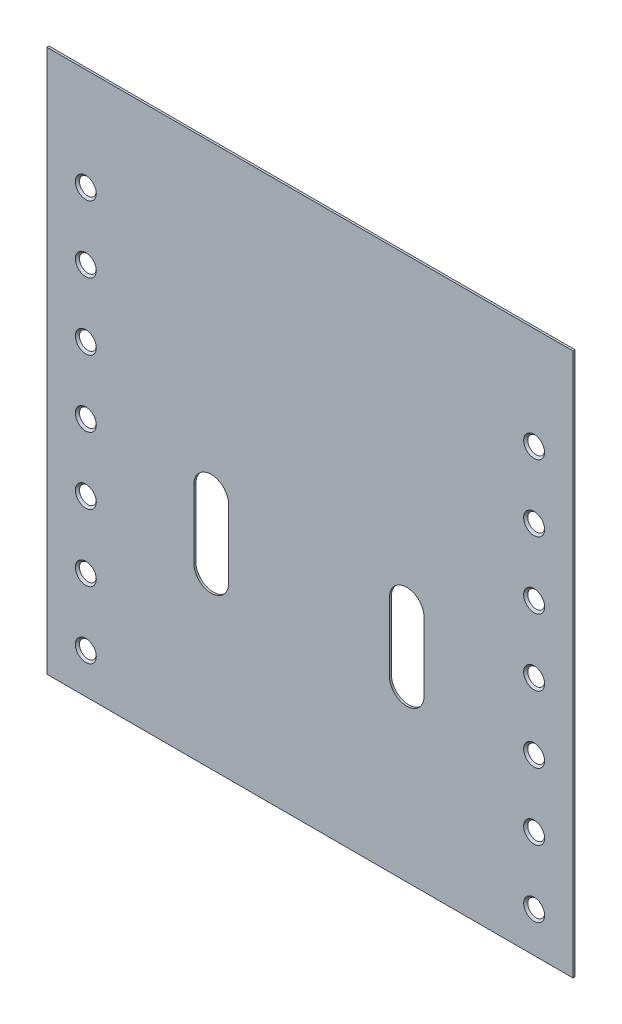
ISO-10303-21;
HEADER;
FILE_DESCRIPTION(('STEP AP214'),'2;1');
FILE_NAME('part.step','',(''),(''),'','','');
FILE_SCHEMA(('AUTOMOTIVE_DESIGN { 1 0 10303 214 1 1 1 1 }'));
ENDSEC;
DATA;
#1=APPLICATION_CONTEXT('core data for automotive mechanical design processes');
#2=APPLICATION_PROTOCOL_DEFINITION('international standard','automotive_design',2000,#1);
#3=PRODUCT_CONTEXT('',#1,'mechanical');
#4=PRODUCT('Part','Part','',(#3));
#5=PRODUCT_RELATED_PRODUCT_CATEGORY('part','',(#4));
#6=PRODUCT_DEFINITION_FORMATION('','',#4);
#7=PRODUCT_DEFINITION_CONTEXT('part definition',#1,'design');
#8=PRODUCT_DEFINITION('design','',#6,#7);
#9=PRODUCT_DEFINITION_SHAPE('','',#8);
#10=(LENGTH_UNIT() NAMED_UNIT(*) SI_UNIT(.MILLI.,.METRE.));
#11=(NAMED_UNIT(*) PLANE_ANGLE_UNIT() SI_UNIT($,.RADIAN.));
#12=(NAMED_UNIT(*) SI_UNIT($,.STERADIAN.) SOLID_ANGLE_UNIT());
#13=UNCERTAINTY_MEASURE_WITH_UNIT(LENGTH_MEASURE(1.E-05),#10,'distance_accuracy_value','');
#14=(GEOMETRIC_REPRESENTATION_CONTEXT(3) GLOBAL_UNCERTAINTY_ASSIGNED_CONTEXT((#13)) GLOBAL_UNIT_ASSIGNED_CONTEXT((#10,
#11,#12)) REPRESENTATION_CONTEXT('',''));
#15=CARTESIAN_POINT('',(0.,0.,0.));
#16=DIRECTION('',(0.,0.,1.));
#17=DIRECTION('',(1.,0.,0.));
#18=AXIS2_PLACEMENT_3D('',#15,#16,#17);
#19=CARTESIAN_POINT('',(0.,0.,-0.7747));
#20=DIRECTION('',(0.,0.,-1.));
#21=DIRECTION('',(-1.,0.,0.));
#22=AXIS2_PLACEMENT_3D('',#19,#20,#21);
#23=PLANE('',#22);
#24=CARTESIAN_POINT('',(-20.9050000000001,-222.,-0.7747));
#25=DIRECTION('',(0.,0.,-1.));
#26=DIRECTION('',(-1.,0.,0.));
#27=AXIS2_PLACEMENT_3D('',#24,#25,#26);
#28=CIRCLE('',#27,3.1373);
#29=CARTESIAN_POINT('',(-24.0423000000001,-222.,-0.7747));
#30=VERTEX_POINT('',#29);
#31=EDGE_CURVE('E36',#30,#30,#28,.T.);
#32=ORIENTED_EDGE('',*,*,#31,.F.);
#33=EDGE_LOOP('',(#32));
#34=FACE_BOUND('',#33,.T.);
#35=CARTESIAN_POINT('',(-20.9050000000003,-147.,-0.7747));
#36=DIRECTION('',(0.,0.,-1.));
#37=DIRECTION('',(-1.,0.,0.));
#38=AXIS2_PLACEMENT_3D('',#35,#36,#37);
#39=CIRCLE('',#38,3.1373);
#40=CARTESIAN_POINT('',(-24.0423000000003,-147.,-0.7747));
#41=VERTEX_POINT('',#40);
#42=EDGE_CURVE('E172',#41,#41,#39,.T.);
#43=ORIENTED_EDGE('',*,*,#42,.F.);
#44=EDGE_LOOP('',(#43));
#45=FACE_BOUND('',#44,.T.);
#46=CARTESIAN_POINT('',(-20.9050000000003,-71.9999999999999,-0.7747));
#47=DIRECTION('',(0.,0.,-1.));
#48=DIRECTION('',(-1.,0.,0.));
#49=AXIS2_PLACEMENT_3D('',#46,#47,#48);
#50=CIRCLE('',#49,3.1373);
#51=CARTESIAN_POINT('',(-24.0423000000003,-71.9999999999999,-0.7747));
#52=VERTEX_POINT('',#51);
#53=EDGE_CURVE('E197',#52,#52,#50,.T.);
#54=ORIENTED_EDGE('',*,*,#53,.F.);
#55=EDGE_LOOP('',(#54));
#56=FACE_BOUND('',#55,.T.);
#57=CARTESIAN_POINT('',(-188.645,-222.,-0.7747));
#58=DIRECTION('',(0.,0.,-1.));
#59=DIRECTION('',(-1.,0.,0.));
#60=AXIS2_PLACEMENT_3D('',#57,#58,#59);
#61=CIRCLE('',#60,3.1373);
#62=CARTESIAN_POINT('',(-191.7823,-222.,-0.7747));
#63=VERTEX_POINT('',#62);
#64=EDGE_CURVE('E203',#63,#63,#61,.T.);
#65=ORIENTED_EDGE('',*,*,#64,.F.);
#66=EDGE_LOOP('',(#65));
#67=FACE_BOUND('',#66,.T.);
#68=CARTESIAN_POINT('',(-188.645,-172.,-0.7747));
#69=DIRECTION('',(0.,0.,-1.));
#70=DIRECTION('',(-1.,0.,0.));
#71=AXIS2_PLACEMENT_3D('',#68,#69,#70);
#72=CIRCLE('',#71,3.1373);
#73=CARTESIAN_POINT('',(-191.7823,-172.,-0.7747));
#74=VERTEX_POINT('',#73);
#75=EDGE_CURVE('E215',#74,#74,#72,.T.);
#76=ORIENTED_EDGE('',*,*,#75,.F.);
#77=EDGE_LOOP('',(#76));
#78=FACE_BOUND('',#77,.T.);
#79=CARTESIAN_POINT('',(-188.645,-122.,-0.7747));
#80=DIRECTION('',(0.,0.,-1.));
#81=DIRECTION('',(-1.,0.,0.));
#82=AXIS2_PLACEMENT_3D('',#79,#80,#81);
#83=CIRCLE('',#82,3.1373);
#84=CARTESIAN_POINT('',(-191.7823,-122.,-0.7747));
#85=VERTEX_POINT('',#84);
#86=EDGE_CURVE('E227',#85,#85,#83,.T.);
#87=ORIENTED_EDGE('',*,*,#86,.F.);
#88=EDGE_LOOP('',(#87));
#89=FACE_BOUND('',#88,.T.);
#90=CARTESIAN_POINT('',(-188.645,-72.,-0.7747));
#91=DIRECTION('',(0.,0.,-1.));
#92=DIRECTION('',(-1.,0.,0.));
#93=AXIS2_PLACEMENT_3D('',#90,#91,#92);
#94=CIRCLE('',#93,3.1373);
#95=CARTESIAN_POINT('',(-191.7823,-72.,-0.7747));
#96=VERTEX_POINT('',#95);
#97=EDGE_CURVE('E141',#96,#96,#94,.T.);
#98=ORIENTED_EDGE('',*,*,#97,.F.);
#99=EDGE_LOOP('',(#98));
#100=FACE_BOUND('',#99,.T.);
#101=CARTESIAN_POINT('',(-68.5692532358968,-173.5,-0.774699999999979));
#102=DIRECTION('',(0.,0.,-1.));
#103=DIRECTION('',(0.,1.,0.));
#104=AXIS2_PLACEMENT_3D('',#101,#102,#103);
#105=CIRCLE('',#104,6.5);
#106=CARTESIAN_POINT('',(-62.0692532358968,-173.5,-0.774699999999979));
#107=VERTEX_POINT('',#106);
#108=CARTESIAN_POINT('',(-75.0692532358968,-173.5,-0.7747));
#109=VERTEX_POINT('',#108);
#110=EDGE_CURVE('E57',#107,#109,#105,.T.);
#111=ORIENTED_EDGE('',*,*,#110,.F.);
#112=DIRECTION('',(0.,-1.,0.));
#113=VECTOR('',#112,1.);
#114=CARTESIAN_POINT('',(-62.0692532358968,-173.5,-0.774699999999979));
#115=LINE('',#114,#113);
#116=CARTESIAN_POINT('',(-62.0692532358968,-148.,-0.774699999999982));
#117=VERTEX_POINT('',#116);
#118=EDGE_CURVE('E272',#117,#107,#115,.T.);
#119=ORIENTED_EDGE('',*,*,#118,.F.);
#120=CARTESIAN_POINT('',(-68.5692532358968,-148.,-0.774699999999982));
#121=DIRECTION('',(0.,0.,-1.));
#122=DIRECTION('',(0.,1.,0.));
#123=AXIS2_PLACEMENT_3D('',#120,#121,#122);
#124=CIRCLE('',#123,6.5);
#125=CARTESIAN_POINT('',(-75.0692532358968,-148.,-0.774699999999982));
#126=VERTEX_POINT('',#125);
#127=EDGE_CURVE('E286',#126,#117,#124,.T.);
#128=ORIENTED_EDGE('',*,*,#127,.F.);
#129=DIRECTION('',(0.,1.,0.));
#130=VECTOR('',#129,1.);
#131=CARTESIAN_POINT('',(-75.0692532358968,-173.5,-0.774699999999979));
#132=LINE('',#131,#130);
#133=EDGE_CURVE('E283',#109,#126,#132,.T.);
#134=ORIENTED_EDGE('',*,*,#133,.F.);
#135=EDGE_LOOP('',(#111,#119,#128,#134));
#136=FACE_BOUND('',#135,.T.);
#137=CARTESIAN_POINT('',(-141.721253235897,-173.5,-0.774699999999979));
#138=DIRECTION('',(0.,0.,-1.));
#139=DIRECTION('',(0.,1.,0.));
#140=AXIS2_PLACEMENT_3D('',#137,#138,#139);
#141=CIRCLE('',#140,6.49999999999995);
#142=CARTESIAN_POINT('',(-135.221253235897,-173.5,-0.774699999999979));
#143=VERTEX_POINT('',#142);
#144=CARTESIAN_POINT('',(-148.221253235897,-173.5,-0.7747));
#145=VERTEX_POINT('',#144);
#146=EDGE_CURVE('E49',#143,#145,#141,.T.);
#147=ORIENTED_EDGE('',*,*,#146,.F.);
#148=DIRECTION('',(0.,-1.,0.));
#149=VECTOR('',#148,1.);
#150=CARTESIAN_POINT('',(-135.221253235897,-173.5,-0.774699999999979));
#151=LINE('',#150,#149);
#152=CARTESIAN_POINT('',(-135.221253235897,-148.,-0.774699999999982));
#153=VERTEX_POINT('',#152);
#154=EDGE_CURVE('E242',#153,#143,#151,.T.);
#155=ORIENTED_EDGE('',*,*,#154,.F.);
#156=CARTESIAN_POINT('',(-141.721253235897,-148.,-0.774699999999982));
#157=DIRECTION('',(0.,0.,-1.));
#158=DIRECTION('',(0.,1.,0.));
#159=AXIS2_PLACEMENT_3D('',#156,#157,#158);
#160=CIRCLE('',#159,6.49999999999995);
#161=CARTESIAN_POINT('',(-148.221253235897,-148.,-0.774699999999982));
#162=VERTEX_POINT('',#161);
#163=EDGE_CURVE('E257',#162,#153,#160,.T.);
#164=ORIENTED_EDGE('',*,*,#163,.F.);
#165=DIRECTION('',(0.,1.,0.));
#166=VECTOR('',#165,1.);
#167=CARTESIAN_POINT('',(-148.221253235897,-173.5,-0.774699999999979));
#168=LINE('',#167,#166);
#169=EDGE_CURVE('E253',#145,#162,#168,.T.);
#170=ORIENTED_EDGE('',*,*,#169,.F.);
#171=EDGE_LOOP('',(#147,#155,#164,#170));
#172=FACE_BOUND('',#171,.T.);
#173=DIRECTION('',(0.,1.,0.));
#174=VECTOR('',#173,1.);
#175=CARTESIAN_POINT('',(-203.2,-237.,-0.7747));
#176=LINE('',#175,#174);
#177=CARTESIAN_POINT('',(-203.2,-237.,-0.7747));
#178=VERTEX_POINT('',#177);
#179=CARTESIAN_POINT('',(-203.2,-33.7999999999999,-0.7747));
#180=VERTEX_POINT('',#179);
#181=EDGE_CURVE('E149',#178,#180,#176,.T.);
#182=ORIENTED_EDGE('',*,*,#181,.T.);
#183=DIRECTION('',(1.,0.,0.));
#184=VECTOR('',#183,1.);
#185=CARTESIAN_POINT('',(-203.2,-33.7999999999999,-0.7747));
#186=LINE('',#185,#184);
#187=CARTESIAN_POINT('',(-6.35000000000006,-33.8,-0.7747));
#188=VERTEX_POINT('',#187);
#189=EDGE_CURVE('E145',#180,#188,#186,.T.);
#190=ORIENTED_EDGE('',*,*,#189,.T.);
#191=DIRECTION('',(0.,-1.,0.));
#192=VECTOR('',#191,1.);
#193=CARTESIAN_POINT('',(-6.35000000000001,-237.,-0.7747));
#194=LINE('',#193,#192);
#195=CARTESIAN_POINT('',(-6.35000000000001,-237.,-0.7747));
#196=VERTEX_POINT('',#195);
#197=EDGE_CURVE('E148',#188,#196,#194,.T.);
#198=ORIENTED_EDGE('',*,*,#197,.T.);
#199=DIRECTION('',(-1.,0.,0.));
#200=VECTOR('',#199,1.);
#201=CARTESIAN_POINT('',(-203.2,-237.,-0.7747));
#202=LINE('',#201,#200);
#203=EDGE_CURVE('E151',#196,#178,#202,.T.);
#204=ORIENTED_EDGE('',*,*,#203,.T.);
#205=EDGE_LOOP('',(#182,#190,#198,#204));
#206=FACE_BOUND('',#205,.T.);
#207=CARTESIAN_POINT('',(-188.645,-96.9999999999999,-0.7747));
#208=DIRECTION('',(0.,0.,-1.));
#209=DIRECTION('',(-1.,0.,0.));
#210=AXIS2_PLACEMENT_3D('',#207,#208,#209);
#211=CIRCLE('',#210,3.1373);
#212=CARTESIAN_POINT('',(-191.7823,-96.9999999999999,-0.7747));
#213=VERTEX_POINT('',#212);
#214=EDGE_CURVE('E233',#213,#213,#211,.T.);
#215=ORIENTED_EDGE('',*,*,#214,.F.);
#216=EDGE_LOOP('',(#215));
#217=FACE_BOUND('',#216,.T.);
#218=CARTESIAN_POINT('',(-188.645,-147.,-0.7747));
#219=DIRECTION('',(0.,0.,-1.));
#220=DIRECTION('',(-1.,0.,0.));
#221=AXIS2_PLACEMENT_3D('',#218,#219,#220);
#222=CIRCLE('',#221,3.1373);
#223=CARTESIAN_POINT('',(-191.7823,-147.,-0.7747));
#224=VERTEX_POINT('',#223);
#225=EDGE_CURVE('E221',#224,#224,#222,.T.);
#226=ORIENTED_EDGE('',*,*,#225,.F.);
#227=EDGE_LOOP('',(#226));
#228=FACE_BOUND('',#227,.T.);
#229=CARTESIAN_POINT('',(-188.645,-197.,-0.7747));
#230=DIRECTION('',(0.,0.,-1.));
#231=DIRECTION('',(-1.,0.,0.));
#232=AXIS2_PLACEMENT_3D('',#229,#230,#231);
#233=CIRCLE('',#232,3.1373);
#234=CARTESIAN_POINT('',(-191.7823,-197.,-0.7747));
#235=VERTEX_POINT('',#234);
#236=EDGE_CURVE('E209',#235,#235,#233,.T.);
#237=ORIENTED_EDGE('',*,*,#236,.F.);
#238=EDGE_LOOP('',(#237));
#239=FACE_BOUND('',#238,.T.);
#240=CARTESIAN_POINT('',(-20.9050000000003,-96.9999999999999,-0.7747));
#241=DIRECTION('',(0.,0.,-1.));
#242=DIRECTION('',(-1.,0.,0.));
#243=AXIS2_PLACEMENT_3D('',#240,#241,#242);
#244=CIRCLE('',#243,3.1373);
#245=CARTESIAN_POINT('',(-24.0423000000003,-96.9999999999999,-0.7747));
#246=VERTEX_POINT('',#245);
#247=EDGE_CURVE('E168',#246,#246,#244,.T.);
#248=ORIENTED_EDGE('',*,*,#247,.F.);
#249=EDGE_LOOP('',(#248));
#250=FACE_BOUND('',#249,.T.);
#251=CARTESIAN_POINT('',(-20.9050000000003,-122.,-0.7747));
#252=DIRECTION('',(0.,0.,-1.));
#253=DIRECTION('',(-1.,0.,0.));
#254=AXIS2_PLACEMENT_3D('',#251,#252,#253);
#255=CIRCLE('',#254,3.1373);
#256=CARTESIAN_POINT('',(-24.0423000000003,-122.,-0.7747));
#257=VERTEX_POINT('',#256);
#258=EDGE_CURVE('E179',#257,#257,#255,.T.);
#259=ORIENTED_EDGE('',*,*,#258,.F.);
#260=EDGE_LOOP('',(#259));
#261=FACE_BOUND('',#260,.T.);
#262=CARTESIAN_POINT('',(-20.9050000000003,-172.,-0.7747));
#263=DIRECTION('',(0.,0.,-1.));
#264=DIRECTION('',(-1.,0.,0.));
#265=AXIS2_PLACEMENT_3D('',#262,#263,#264);
#266=CIRCLE('',#265,3.1373);
#267=CARTESIAN_POINT('',(-24.0423000000003,-172.,-0.7747));
#268=VERTEX_POINT('',#267);
#269=EDGE_CURVE('E182',#268,#268,#266,.T.);
#270=ORIENTED_EDGE('',*,*,#269,.F.);
#271=EDGE_LOOP('',(#270));
#272=FACE_BOUND('',#271,.T.);
#273=CARTESIAN_POINT('',(-20.9050000000003,-197.,-0.7747));
#274=DIRECTION('',(0.,0.,-1.));
#275=DIRECTION('',(-1.,0.,0.));
#276=AXIS2_PLACEMENT_3D('',#273,#274,#275);
#277=CIRCLE('',#276,3.1373);
#278=CARTESIAN_POINT('',(-24.0423000000003,-197.,-0.7747));
#279=VERTEX_POINT('',#278);
#280=EDGE_CURVE('E611',#279,#279,#277,.T.);
#281=ORIENTED_EDGE('',*,*,#280,.F.);
#282=EDGE_LOOP('',(#281));
#283=FACE_BOUND('',#282,.T.);
#284=ADVANCED_FACE('F32',(#34,#45,#56,#67,#78,#89,#100,#136,#172,#206,#217,#228,#239,#250,#261,
#272,#283),#23,.T.);
#285=CARTESIAN_POINT('',(0.,0.,0.));
#286=DIRECTION('',(0.,0.,-1.));
#287=DIRECTION('',(-1.,0.,0.));
#288=AXIS2_PLACEMENT_3D('',#285,#286,#287);
#289=PLANE('',#288);
#290=CARTESIAN_POINT('',(-20.9050000000001,-222.,0.));
#291=DIRECTION('',(0.,0.,1.));
#292=DIRECTION('',(1.,0.,0.));
#293=AXIS2_PLACEMENT_3D('',#290,#291,#292);
#294=CIRCLE('',#293,3.912);
#295=CARTESIAN_POINT('',(-16.9930000000001,-222.,0.));
#296=VERTEX_POINT('',#295);
#297=EDGE_CURVE('E618',#296,#296,#294,.T.);
#298=ORIENTED_EDGE('',*,*,#297,.F.);
#299=EDGE_LOOP('',(#298));
#300=FACE_BOUND('',#299,.T.);
#301=CARTESIAN_POINT('',(-20.9050000000003,-147.,0.));
#302=DIRECTION('',(0.,0.,1.));
#303=DIRECTION('',(1.,0.,0.));
#304=AXIS2_PLACEMENT_3D('',#301,#302,#303);
#305=CIRCLE('',#304,3.912);
#306=CARTESIAN_POINT('',(-16.9930000000003,-147.,0.));
#307=VERTEX_POINT('',#306);
#308=EDGE_CURVE('E175',#307,#307,#305,.T.);
#309=ORIENTED_EDGE('',*,*,#308,.F.);
#310=EDGE_LOOP('',(#309));
#311=FACE_BOUND('',#310,.T.);
#312=CARTESIAN_POINT('',(-20.9050000000003,-96.9999999999999,0.));
#313=DIRECTION('',(0.,0.,1.));
#314=DIRECTION('',(1.,0.,0.));
#315=AXIS2_PLACEMENT_3D('',#312,#313,#314);
#316=CIRCLE('',#315,3.912);
#317=CARTESIAN_POINT('',(-16.9930000000003,-96.9999999999999,0.));
#318=VERTEX_POINT('',#317);
#319=EDGE_CURVE('E171',#318,#318,#316,.T.);
#320=ORIENTED_EDGE('',*,*,#319,.F.);
#321=EDGE_LOOP('',(#320));
#322=FACE_BOUND('',#321,.T.);
#323=CARTESIAN_POINT('',(-188.645,-222.,0.));
#324=DIRECTION('',(0.,0.,1.));
#325=DIRECTION('',(1.,0.,0.));
#326=AXIS2_PLACEMENT_3D('',#323,#324,#325);
#327=CIRCLE('',#326,3.912);
#328=CARTESIAN_POINT('',(-184.733,-222.,0.));
#329=VERTEX_POINT('',#328);
#330=EDGE_CURVE('E200',#329,#329,#327,.T.);
#331=ORIENTED_EDGE('',*,*,#330,.F.);
#332=EDGE_LOOP('',(#331));
#333=FACE_BOUND('',#332,.T.);
#334=CARTESIAN_POINT('',(-188.645,-197.,0.));
#335=DIRECTION('',(0.,0.,1.));
#336=DIRECTION('',(1.,0.,0.));
#337=AXIS2_PLACEMENT_3D('',#334,#335,#336);
#338=CIRCLE('',#337,3.912);
#339=CARTESIAN_POINT('',(-184.733,-197.,0.));
#340=VERTEX_POINT('',#339);
#341=EDGE_CURVE('E206',#340,#340,#338,.T.);
#342=ORIENTED_EDGE('',*,*,#341,.F.);
#343=EDGE_LOOP('',(#342));
#344=FACE_BOUND('',#343,.T.);
#345=CARTESIAN_POINT('',(-188.645,-172.,0.));
#346=DIRECTION('',(0.,0.,1.));
#347=DIRECTION('',(1.,0.,0.));
#348=AXIS2_PLACEMENT_3D('',#345,#346,#347);
#349=CIRCLE('',#348,3.912);
#350=CARTESIAN_POINT('',(-184.733,-172.,0.));
#351=VERTEX_POINT('',#350);
#352=EDGE_CURVE('E212',#351,#351,#349,.T.);
#353=ORIENTED_EDGE('',*,*,#352,.F.);
#354=EDGE_LOOP('',(#353));
#355=FACE_BOUND('',#354,.T.);
#356=CARTESIAN_POINT('',(-188.645,-147.,0.));
#357=DIRECTION('',(0.,0.,1.));
#358=DIRECTION('',(1.,0.,0.));
#359=AXIS2_PLACEMENT_3D('',#356,#357,#358);
#360=CIRCLE('',#359,3.912);
#361=CARTESIAN_POINT('',(-184.733,-147.,0.));
#362=VERTEX_POINT('',#361);
#363=EDGE_CURVE('E218',#362,#362,#360,.T.);
#364=ORIENTED_EDGE('',*,*,#363,.F.);
#365=EDGE_LOOP('',(#364));
#366=FACE_BOUND('',#365,.T.);
#367=CARTESIAN_POINT('',(-188.645,-122.,0.));
#368=DIRECTION('',(0.,0.,1.));
#369=DIRECTION('',(1.,0.,0.));
#370=AXIS2_PLACEMENT_3D('',#367,#368,#369);
#371=CIRCLE('',#370,3.912);
#372=CARTESIAN_POINT('',(-184.733,-122.,0.));
#373=VERTEX_POINT('',#372);
#374=EDGE_CURVE('E224',#373,#373,#371,.T.);
#375=ORIENTED_EDGE('',*,*,#374,.F.);
#376=EDGE_LOOP('',(#375));
#377=FACE_BOUND('',#376,.T.);
#378=CARTESIAN_POINT('',(-188.645,-96.9999999999999,0.));
#379=DIRECTION('',(0.,0.,1.));
#380=DIRECTION('',(1.,0.,0.));
#381=AXIS2_PLACEMENT_3D('',#378,#379,#380);
#382=CIRCLE('',#381,3.912);
#383=CARTESIAN_POINT('',(-184.733,-96.9999999999999,0.));
#384=VERTEX_POINT('',#383);
#385=EDGE_CURVE('E230',#384,#384,#382,.T.);
#386=ORIENTED_EDGE('',*,*,#385,.F.);
#387=EDGE_LOOP('',(#386));
#388=FACE_BOUND('',#387,.T.);
#389=CARTESIAN_POINT('',(-188.645,-72.,0.));
#390=DIRECTION('',(0.,0.,1.));
#391=DIRECTION('',(1.,0.,0.));
#392=AXIS2_PLACEMENT_3D('',#389,#390,#391);
#393=CIRCLE('',#392,3.912);
#394=CARTESIAN_POINT('',(-184.733,-72.,0.));
#395=VERTEX_POINT('',#394);
#396=EDGE_CURVE('E167',#395,#395,#393,.T.);
#397=ORIENTED_EDGE('',*,*,#396,.F.);
#398=EDGE_LOOP('',(#397));
#399=FACE_BOUND('',#398,.T.);
#400=DIRECTION('',(0.,-1.,0.));
#401=VECTOR('',#400,1.);
#402=CARTESIAN_POINT('',(-62.0692532358968,-173.5,0.));
#403=LINE('',#402,#401);
#404=CARTESIAN_POINT('',(-62.0692532358968,-148.,0.));
#405=VERTEX_POINT('',#404);
#406=CARTESIAN_POINT('',(-62.0692532358968,-173.5,0.));
#407=VERTEX_POINT('',#406);
#408=EDGE_CURVE('E278',#405,#407,#403,.T.);
#409=ORIENTED_EDGE('',*,*,#408,.T.);
#410=CARTESIAN_POINT('',(-68.5692532358968,-173.5,0.));
#411=DIRECTION('',(0.,0.,-1.));
#412=DIRECTION('',(0.,1.,0.));
#413=AXIS2_PLACEMENT_3D('',#410,#411,#412);
#414=CIRCLE('',#413,6.5);
#415=CARTESIAN_POINT('',(-75.0692532358968,-173.5,0.));
#416=VERTEX_POINT('',#415);
#417=EDGE_CURVE('E268',#407,#416,#414,.T.);
#418=ORIENTED_EDGE('',*,*,#417,.T.);
#419=DIRECTION('',(0.,1.,0.));
#420=VECTOR('',#419,1.);
#421=CARTESIAN_POINT('',(-75.0692532358968,-173.5,0.));
#422=LINE('',#421,#420);
#423=CARTESIAN_POINT('',(-75.0692532358968,-148.,0.));
#424=VERTEX_POINT('',#423);
#425=EDGE_CURVE('E271',#416,#424,#422,.T.);
#426=ORIENTED_EDGE('',*,*,#425,.T.);
#427=CARTESIAN_POINT('',(-68.5692532358968,-148.,0.));
#428=DIRECTION('',(0.,0.,-1.));
#429=DIRECTION('',(0.,1.,0.));
#430=AXIS2_PLACEMENT_3D('',#427,#428,#429);
#431=CIRCLE('',#430,6.5);
#432=EDGE_CURVE('E275',#424,#405,#431,.T.);
#433=ORIENTED_EDGE('',*,*,#432,.T.);
#434=EDGE_LOOP('',(#409,#418,#426,#433));
#435=FACE_BOUND('',#434,.T.);
#436=DIRECTION('',(0.,-1.,0.));
#437=VECTOR('',#436,1.);
#438=CARTESIAN_POINT('',(-135.221253235897,-173.5,0.));
#439=LINE('',#438,#437);
#440=CARTESIAN_POINT('',(-135.221253235897,-148.,0.));
#441=VERTEX_POINT('',#440);
#442=CARTESIAN_POINT('',(-135.221253235897,-173.5,0.));
#443=VERTEX_POINT('',#442);
#444=EDGE_CURVE('E248',#441,#443,#439,.T.);
#445=ORIENTED_EDGE('',*,*,#444,.T.);
#446=CARTESIAN_POINT('',(-141.721253235897,-173.5,0.));
#447=DIRECTION('',(0.,0.,-1.));
#448=DIRECTION('',(0.,1.,0.));
#449=AXIS2_PLACEMENT_3D('',#446,#447,#448);
#450=CIRCLE('',#449,6.49999999999995);
#451=CARTESIAN_POINT('',(-148.221253235897,-173.5,0.));
#452=VERTEX_POINT('',#451);
#453=EDGE_CURVE('E238',#443,#452,#450,.T.);
#454=ORIENTED_EDGE('',*,*,#453,.T.);
#455=DIRECTION('',(0.,1.,0.));
#456=VECTOR('',#455,1.);
#457=CARTESIAN_POINT('',(-148.221253235897,-173.5,0.));
#458=LINE('',#457,#456);
#459=CARTESIAN_POINT('',(-148.221253235897,-148.,0.));
#460=VERTEX_POINT('',#459);
#461=EDGE_CURVE('E241',#452,#460,#458,.T.);
#462=ORIENTED_EDGE('',*,*,#461,.T.);
#463=CARTESIAN_POINT('',(-141.721253235897,-148.,0.));
#464=DIRECTION('',(0.,0.,-1.));
#465=DIRECTION('',(0.,1.,0.));
#466=AXIS2_PLACEMENT_3D('',#463,#464,#465);
#467=CIRCLE('',#466,6.49999999999995);
#468=EDGE_CURVE('E245',#460,#441,#467,.T.);
#469=ORIENTED_EDGE('',*,*,#468,.T.);
#470=EDGE_LOOP('',(#445,#454,#462,#469));
#471=FACE_BOUND('',#470,.T.);
#472=DIRECTION('',(-1.,0.,0.));
#473=VECTOR('',#472,1.);
#474=CARTESIAN_POINT('',(-203.2,-237.,0.));
#475=LINE('',#474,#473);
#476=CARTESIAN_POINT('',(-6.35000000000001,-237.,0.));
#477=VERTEX_POINT('',#476);
#478=CARTESIAN_POINT('',(-203.2,-237.,0.));
#479=VERTEX_POINT('',#478);
#480=EDGE_CURVE('E153',#477,#479,#475,.T.);
#481=ORIENTED_EDGE('',*,*,#480,.F.);
#482=DIRECTION('',(0.,-1.,0.));
#483=VECTOR('',#482,1.);
#484=CARTESIAN_POINT('',(-6.35000000000001,-237.,0.));
#485=LINE('',#484,#483);
#486=CARTESIAN_POINT('',(-6.35000000000006,-33.7999999999999,0.));
#487=VERTEX_POINT('',#486);
#488=EDGE_CURVE('E131',#487,#477,#485,.T.);
#489=ORIENTED_EDGE('',*,*,#488,.F.);
#490=DIRECTION('',(-1.,0.,0.));
#491=VECTOR('',#490,1.);
#492=CARTESIAN_POINT('',(-6.35000000000006,-33.7999999999999,0.));
#493=LINE('',#492,#491);
#494=CARTESIAN_POINT('',(-203.2,-33.8,0.));
#495=VERTEX_POINT('',#494);
#496=EDGE_CURVE('E135',#487,#495,#493,.T.);
#497=ORIENTED_EDGE('',*,*,#496,.T.);
#498=DIRECTION('',(0.,1.,0.));
#499=VECTOR('',#498,1.);
#500=CARTESIAN_POINT('',(-203.2,-237.,0.));
#501=LINE('',#500,#499);
#502=EDGE_CURVE('E124',#479,#495,#501,.T.);
#503=ORIENTED_EDGE('',*,*,#502,.F.);
#504=EDGE_LOOP('',(#481,#489,#497,#503));
#505=FACE_BOUND('',#504,.T.);
#506=CARTESIAN_POINT('',(-20.9050000000003,-71.9999999999999,0.));
#507=DIRECTION('',(0.,0.,1.));
#508=DIRECTION('',(1.,0.,0.));
#509=AXIS2_PLACEMENT_3D('',#506,#507,#508);
#510=CIRCLE('',#509,3.912);
#511=CARTESIAN_POINT('',(-16.9930000000003,-71.9999999999999,0.));
#512=VERTEX_POINT('',#511);
#513=EDGE_CURVE('E170',#512,#512,#510,.T.);
#514=ORIENTED_EDGE('',*,*,#513,.F.);
#515=EDGE_LOOP('',(#514));
#516=FACE_BOUND('',#515,.T.);
#517=CARTESIAN_POINT('',(-20.9050000000003,-122.,0.));
#518=DIRECTION('',(0.,0.,1.));
#519=DIRECTION('',(1.,0.,0.));
#520=AXIS2_PLACEMENT_3D('',#517,#518,#519);
#521=CIRCLE('',#520,3.912);
#522=CARTESIAN_POINT('',(-16.9930000000003,-122.,0.));
#523=VERTEX_POINT('',#522);
#524=EDGE_CURVE('E174',#523,#523,#521,.T.);
#525=ORIENTED_EDGE('',*,*,#524,.F.);
#526=EDGE_LOOP('',(#525));
#527=FACE_BOUND('',#526,.T.);
#528=CARTESIAN_POINT('',(-20.9050000000003,-172.,0.));
#529=DIRECTION('',(0.,0.,1.));
#530=DIRECTION('',(1.,0.,0.));
#531=AXIS2_PLACEMENT_3D('',#528,#529,#530);
#532=CIRCLE('',#531,3.912);
#533=CARTESIAN_POINT('',(-16.9930000000003,-172.,0.));
#534=VERTEX_POINT('',#533);
#535=EDGE_CURVE('E187',#534,#534,#532,.T.);
#536=ORIENTED_EDGE('',*,*,#535,.F.);
#537=EDGE_LOOP('',(#536));
#538=FACE_BOUND('',#537,.T.);
#539=CARTESIAN_POINT('',(-20.9050000000003,-197.,0.));
#540=DIRECTION('',(0.,0.,1.));
#541=DIRECTION('',(1.,0.,0.));
#542=AXIS2_PLACEMENT_3D('',#539,#540,#541);
#543=CIRCLE('',#542,3.912);
#544=CARTESIAN_POINT('',(-16.9930000000003,-197.,0.));
#545=VERTEX_POINT('',#544);
#546=EDGE_CURVE('E612',#545,#545,#543,.T.);
#547=ORIENTED_EDGE('',*,*,#546,.F.);
#548=EDGE_LOOP('',(#547));
#549=FACE_BOUND('',#548,.T.);
#550=ADVANCED_FACE('F136',(#300,#311,#322,#333,#344,#355,#366,#377,#388,#399,#435,#471,#505,
#516,#527,#538,#549),#289,.F.);
#551=CARTESIAN_POINT('',(-203.2,-237.,-0.7747));
#552=DIRECTION('',(1.,0.,0.));
#553=DIRECTION('',(0.,1.,0.));
#554=AXIS2_PLACEMENT_3D('',#551,#552,#553);
#555=PLANE('',#554);
#556=ORIENTED_EDGE('',*,*,#502,.T.);
#557=DIRECTION('',(0.,0.,1.));
#558=VECTOR('',#557,1.);
#559=CARTESIAN_POINT('',(-203.2,-33.7999999999999,-0.7747));
#560=LINE('',#559,#558);
#561=EDGE_CURVE('E11',#180,#495,#560,.T.);
#562=ORIENTED_EDGE('',*,*,#561,.F.);
#563=ORIENTED_EDGE('',*,*,#181,.F.);
#564=DIRECTION('',(0.,0.,1.));
#565=VECTOR('',#564,1.);
#566=CARTESIAN_POINT('',(-203.2,-237.,-0.7747));
#567=LINE('',#566,#565);
#568=EDGE_CURVE('E128',#178,#479,#567,.T.);
#569=ORIENTED_EDGE('',*,*,#568,.T.);
#570=EDGE_LOOP('',(#556,#562,#563,#569));
#571=FACE_BOUND('',#570,.T.);
#572=ADVANCED_FACE('F34',(#571),#555,.F.);
#573=CARTESIAN_POINT('',(-203.2,-33.7999999999999,-0.7747));
#574=DIRECTION('',(0.,-1.,0.));
#575=DIRECTION('',(1.,0.,0.));
#576=AXIS2_PLACEMENT_3D('',#573,#574,#575);
#577=PLANE('',#576);
#578=ORIENTED_EDGE('',*,*,#561,.T.);
#579=ORIENTED_EDGE('',*,*,#496,.F.);
#580=DIRECTION('',(0.,0.,1.));
#581=VECTOR('',#580,1.);
#582=CARTESIAN_POINT('',(-6.35000000000006,-33.8,-0.7747));
#583=LINE('',#582,#581);
#584=EDGE_CURVE('E41',#188,#487,#583,.T.);
#585=ORIENTED_EDGE('',*,*,#584,.F.);
#586=ORIENTED_EDGE('',*,*,#189,.F.);
#587=EDGE_LOOP('',(#578,#579,#585,#586));
#588=FACE_BOUND('',#587,.T.);
#589=ADVANCED_FACE('F144',(#588),#577,.F.);
#590=CARTESIAN_POINT('',(-6.35000000000001,-237.,-0.7747));
#591=DIRECTION('',(-1.,0.,0.));
#592=DIRECTION('',(0.,-1.,0.));
#593=AXIS2_PLACEMENT_3D('',#590,#591,#592);
#594=PLANE('',#593);
#595=ORIENTED_EDGE('',*,*,#584,.T.);
#596=ORIENTED_EDGE('',*,*,#488,.T.);
#597=DIRECTION('',(0.,0.,1.));
#598=VECTOR('',#597,1.);
#599=CARTESIAN_POINT('',(-6.35000000000001,-237.,-0.7747));
#600=LINE('',#599,#598);
#601=EDGE_CURVE('E161',#196,#477,#600,.T.);
#602=ORIENTED_EDGE('',*,*,#601,.F.);
#603=ORIENTED_EDGE('',*,*,#197,.F.);
#604=EDGE_LOOP('',(#595,#596,#602,#603));
#605=FACE_BOUND('',#604,.T.);
#606=ADVANCED_FACE('F337',(#605),#594,.F.);
#607=CARTESIAN_POINT('',(-203.2,-237.,-0.7747));
#608=DIRECTION('',(0.,1.,0.));
#609=DIRECTION('',(0.,0.,1.));
#610=AXIS2_PLACEMENT_3D('',#607,#608,#609);
#611=PLANE('',#610);
#612=ORIENTED_EDGE('',*,*,#480,.T.);
#613=ORIENTED_EDGE('',*,*,#568,.F.);
#614=ORIENTED_EDGE('',*,*,#203,.F.);
#615=ORIENTED_EDGE('',*,*,#601,.T.);
#616=EDGE_LOOP('',(#612,#613,#614,#615));
#617=FACE_BOUND('',#616,.T.);
#618=ADVANCED_FACE('F320',(#617),#611,.F.);
#619=CARTESIAN_POINT('',(-68.5692532358968,-173.5,0.));
#620=DIRECTION('',(0.,0.,-1.));
#621=DIRECTION('',(0.,1.,0.));
#622=AXIS2_PLACEMENT_3D('',#619,#620,#621);
#623=CYLINDRICAL_SURFACE('',#622,6.5);
#624=ORIENTED_EDGE('',*,*,#110,.T.);
#625=DIRECTION('',(0.,0.,-1.));
#626=VECTOR('',#625,1.);
#627=CARTESIAN_POINT('',(-75.0692532358968,-173.5,0.));
#628=LINE('',#627,#626);
#629=EDGE_CURVE('E281',#416,#109,#628,.T.);
#630=ORIENTED_EDGE('',*,*,#629,.F.);
#631=ORIENTED_EDGE('',*,*,#417,.F.);
#632=DIRECTION('',(0.,0.,-1.));
#633=VECTOR('',#632,1.);
#634=CARTESIAN_POINT('',(-62.0692532358968,-173.5,0.));
#635=LINE('',#634,#633);
#636=EDGE_CURVE('E254',#407,#107,#635,.T.);
#637=ORIENTED_EDGE('',*,*,#636,.T.);
#638=EDGE_LOOP('',(#624,#630,#631,#637));
#639=FACE_BOUND('',#638,.T.);
#640=ADVANCED_FACE('F310',(#639),#623,.F.);
#641=CARTESIAN_POINT('',(-62.0692532358968,-173.5,0.));
#642=DIRECTION('',(1.,0.,0.));
#643=DIRECTION('',(0.,1.,0.));
#644=AXIS2_PLACEMENT_3D('',#641,#642,#643);
#645=PLANE('',#644);
#646=ORIENTED_EDGE('',*,*,#118,.T.);
#647=ORIENTED_EDGE('',*,*,#636,.F.);
#648=ORIENTED_EDGE('',*,*,#408,.F.);
#649=DIRECTION('',(0.,0.,-1.));
#650=VECTOR('',#649,1.);
#651=CARTESIAN_POINT('',(-62.0692532358968,-148.,0.));
#652=LINE('',#651,#650);
#653=EDGE_CURVE('E292',#405,#117,#652,.T.);
#654=ORIENTED_EDGE('',*,*,#653,.T.);
#655=EDGE_LOOP('',(#646,#647,#648,#654));
#656=FACE_BOUND('',#655,.T.);
#657=ADVANCED_FACE('F312',(#656),#645,.F.);
#658=CARTESIAN_POINT('',(-68.5692532358968,-148.,0.));
#659=DIRECTION('',(0.,0.,-1.));
#660=DIRECTION('',(0.,1.,0.));
#661=AXIS2_PLACEMENT_3D('',#658,#659,#660);
#662=CYLINDRICAL_SURFACE('',#661,6.5);
#663=ORIENTED_EDGE('',*,*,#127,.T.);
#664=ORIENTED_EDGE('',*,*,#653,.F.);
#665=ORIENTED_EDGE('',*,*,#432,.F.);
#666=DIRECTION('',(0.,0.,-1.));
#667=VECTOR('',#666,1.);
#668=CARTESIAN_POINT('',(-75.0692532358968,-148.,0.));
#669=LINE('',#668,#667);
#670=EDGE_CURVE('E294',#424,#126,#669,.T.);
#671=ORIENTED_EDGE('',*,*,#670,.T.);
#672=EDGE_LOOP('',(#663,#664,#665,#671));
#673=FACE_BOUND('',#672,.T.);
#674=ADVANCED_FACE('F306',(#673),#662,.F.);
#675=CARTESIAN_POINT('',(-75.0692532358968,-173.5,0.));
#676=DIRECTION('',(-1.,0.,0.));
#677=DIRECTION('',(0.,-1.,0.));
#678=AXIS2_PLACEMENT_3D('',#675,#676,#677);
#679=PLANE('',#678);
#680=ORIENTED_EDGE('',*,*,#133,.T.);
#681=ORIENTED_EDGE('',*,*,#670,.F.);
#682=ORIENTED_EDGE('',*,*,#425,.F.);
#683=ORIENTED_EDGE('',*,*,#629,.T.);
#684=EDGE_LOOP('',(#680,#681,#682,#683));
#685=FACE_BOUND('',#684,.T.);
#686=ADVANCED_FACE('F298',(#685),#679,.F.);
#687=CARTESIAN_POINT('',(-141.721253235897,-173.5,0.));
#688=DIRECTION('',(0.,0.,-1.));
#689=DIRECTION('',(0.,1.,0.));
#690=AXIS2_PLACEMENT_3D('',#687,#688,#689);
#691=CYLINDRICAL_SURFACE('',#690,6.49999999999995);
#692=ORIENTED_EDGE('',*,*,#146,.T.);
#693=DIRECTION('',(0.,0.,-1.));
#694=VECTOR('',#693,1.);
#695=CARTESIAN_POINT('',(-148.221253235897,-173.5,0.));
#696=LINE('',#695,#694);
#697=EDGE_CURVE('E251',#452,#145,#696,.T.);
#698=ORIENTED_EDGE('',*,*,#697,.F.);
#699=ORIENTED_EDGE('',*,*,#453,.F.);
#700=DIRECTION('',(0.,0.,-1.));
#701=VECTOR('',#700,1.);
#702=CARTESIAN_POINT('',(-135.221253235897,-173.5,0.));
#703=LINE('',#702,#701);
#704=EDGE_CURVE('E132',#443,#143,#703,.T.);
#705=ORIENTED_EDGE('',*,*,#704,.T.);
#706=EDGE_LOOP('',(#692,#698,#699,#705));
#707=FACE_BOUND('',#706,.T.);
#708=ADVANCED_FACE('F465',(#707),#691,.F.);
#709=CARTESIAN_POINT('',(-135.221253235897,-173.5,0.));
#710=DIRECTION('',(1.,0.,0.));
#711=DIRECTION('',(0.,0.,-1.));
#712=AXIS2_PLACEMENT_3D('',#709,#710,#711);
#713=PLANE('',#712);
#714=ORIENTED_EDGE('',*,*,#154,.T.);
#715=ORIENTED_EDGE('',*,*,#704,.F.);
#716=ORIENTED_EDGE('',*,*,#444,.F.);
#717=DIRECTION('',(0.,0.,-1.));
#718=VECTOR('',#717,1.);
#719=CARTESIAN_POINT('',(-135.221253235897,-148.,0.));
#720=LINE('',#719,#718);
#721=EDGE_CURVE('E263',#441,#153,#720,.T.);
#722=ORIENTED_EDGE('',*,*,#721,.T.);
#723=EDGE_LOOP('',(#714,#715,#716,#722));
#724=FACE_BOUND('',#723,.T.);
#725=ADVANCED_FACE('F461',(#724),#713,.F.);
#726=CARTESIAN_POINT('',(-141.721253235897,-148.,0.));
#727=DIRECTION('',(0.,0.,-1.));
#728=DIRECTION('',(0.,1.,0.));
#729=AXIS2_PLACEMENT_3D('',#726,#727,#728);
#730=CYLINDRICAL_SURFACE('',#729,6.49999999999995);
#731=ORIENTED_EDGE('',*,*,#163,.T.);
#732=ORIENTED_EDGE('',*,*,#721,.F.);
#733=ORIENTED_EDGE('',*,*,#468,.F.);
#734=DIRECTION('',(0.,0.,-1.));
#735=VECTOR('',#734,1.);
#736=CARTESIAN_POINT('',(-148.221253235897,-148.,0.));
#737=LINE('',#736,#735);
#738=EDGE_CURVE('E265',#460,#162,#737,.T.);
#739=ORIENTED_EDGE('',*,*,#738,.T.);
#740=EDGE_LOOP('',(#731,#732,#733,#739));
#741=FACE_BOUND('',#740,.T.);
#742=ADVANCED_FACE('F464',(#741),#730,.F.);
#743=CARTESIAN_POINT('',(-148.221253235897,-173.5,0.));
#744=DIRECTION('',(-1.,0.,0.));
#745=DIRECTION('',(0.,0.,1.));
#746=AXIS2_PLACEMENT_3D('',#743,#744,#745);
#747=PLANE('',#746);
#748=ORIENTED_EDGE('',*,*,#169,.T.);
#749=ORIENTED_EDGE('',*,*,#738,.F.);
#750=ORIENTED_EDGE('',*,*,#461,.F.);
#751=ORIENTED_EDGE('',*,*,#697,.T.);
#752=EDGE_LOOP('',(#748,#749,#750,#751));
#753=FACE_BOUND('',#752,.T.);
#754=ADVANCED_FACE('F459',(#753),#747,.F.);
#755=CARTESIAN_POINT('',(-188.645,-72.,0.));
#756=DIRECTION('',(0.,0.,1.));
#757=DIRECTION('',(1.,0.,0.));
#758=AXIS2_PLACEMENT_3D('',#755,#756,#757);
#759=CONICAL_SURFACE('',#758,3.912,0.785398163397447);
#760=ORIENTED_EDGE('',*,*,#97,.T.);
#761=EDGE_LOOP('',(#760));
#762=FACE_BOUND('',#761,.T.);
#763=ORIENTED_EDGE('',*,*,#396,.T.);
#764=EDGE_LOOP('',(#763));
#765=FACE_BOUND('',#764,.T.);
#766=ADVANCED_FACE('F455',(#762,#765),#759,.F.);
#767=CARTESIAN_POINT('',(-188.645,-96.9999999999999,0.));
#768=DIRECTION('',(0.,0.,1.));
#769=DIRECTION('',(1.,0.,0.));
#770=AXIS2_PLACEMENT_3D('',#767,#768,#769);
#771=CONICAL_SURFACE('',#770,3.912,0.785398163397447);
#772=ORIENTED_EDGE('',*,*,#214,.T.);
#773=EDGE_LOOP('',(#772));
#774=FACE_BOUND('',#773,.T.);
#775=ORIENTED_EDGE('',*,*,#385,.T.);
#776=EDGE_LOOP('',(#775));
#777=FACE_BOUND('',#776,.T.);
#778=ADVANCED_FACE('F451',(#774,#777),#771,.F.);
#779=CARTESIAN_POINT('',(-188.645,-122.,0.));
#780=DIRECTION('',(0.,0.,1.));
#781=DIRECTION('',(1.,0.,0.));
#782=AXIS2_PLACEMENT_3D('',#779,#780,#781);
#783=CONICAL_SURFACE('',#782,3.912,0.785398163397447);
#784=ORIENTED_EDGE('',*,*,#86,.T.);
#785=EDGE_LOOP('',(#784));
#786=FACE_BOUND('',#785,.T.);
#787=ORIENTED_EDGE('',*,*,#374,.T.);
#788=EDGE_LOOP('',(#787));
#789=FACE_BOUND('',#788,.T.);
#790=ADVANCED_FACE('F447',(#786,#789),#783,.F.);
#791=CARTESIAN_POINT('',(-188.645,-147.,0.));
#792=DIRECTION('',(0.,0.,1.));
#793=DIRECTION('',(1.,0.,0.));
#794=AXIS2_PLACEMENT_3D('',#791,#792,#793);
#795=CONICAL_SURFACE('',#794,3.912,0.785398163397447);
#796=ORIENTED_EDGE('',*,*,#225,.T.);
#797=EDGE_LOOP('',(#796));
#798=FACE_BOUND('',#797,.T.);
#799=ORIENTED_EDGE('',*,*,#363,.T.);
#800=EDGE_LOOP('',(#799));
#801=FACE_BOUND('',#800,.T.);
#802=ADVANCED_FACE('F443',(#798,#801),#795,.F.);
#803=CARTESIAN_POINT('',(-188.645,-172.,0.));
#804=DIRECTION('',(0.,0.,1.));
#805=DIRECTION('',(1.,0.,0.));
#806=AXIS2_PLACEMENT_3D('',#803,#804,#805);
#807=CONICAL_SURFACE('',#806,3.912,0.785398163397447);
#808=ORIENTED_EDGE('',*,*,#75,.T.);
#809=EDGE_LOOP('',(#808));
#810=FACE_BOUND('',#809,.T.);
#811=ORIENTED_EDGE('',*,*,#352,.T.);
#812=EDGE_LOOP('',(#811));
#813=FACE_BOUND('',#812,.T.);
#814=ADVANCED_FACE('F439',(#810,#813),#807,.F.);
#815=CARTESIAN_POINT('',(-188.645,-197.,0.));
#816=DIRECTION('',(0.,0.,1.));
#817=DIRECTION('',(1.,0.,0.));
#818=AXIS2_PLACEMENT_3D('',#815,#816,#817);
#819=CONICAL_SURFACE('',#818,3.912,0.785398163397447);
#820=ORIENTED_EDGE('',*,*,#236,.T.);
#821=EDGE_LOOP('',(#820));
#822=FACE_BOUND('',#821,.T.);
#823=ORIENTED_EDGE('',*,*,#341,.T.);
#824=EDGE_LOOP('',(#823));
#825=FACE_BOUND('',#824,.T.);
#826=ADVANCED_FACE('F435',(#822,#825),#819,.F.);
#827=CARTESIAN_POINT('',(-188.645,-222.,0.));
#828=DIRECTION('',(0.,0.,1.));
#829=DIRECTION('',(1.,0.,0.));
#830=AXIS2_PLACEMENT_3D('',#827,#828,#829);
#831=CONICAL_SURFACE('',#830,3.912,0.785398163397447);
#832=ORIENTED_EDGE('',*,*,#64,.T.);
#833=EDGE_LOOP('',(#832));
#834=FACE_BOUND('',#833,.T.);
#835=ORIENTED_EDGE('',*,*,#330,.T.);
#836=EDGE_LOOP('',(#835));
#837=FACE_BOUND('',#836,.T.);
#838=ADVANCED_FACE('F367',(#834,#837),#831,.F.);
#839=CARTESIAN_POINT('',(-20.9050000000003,-71.9999999999999,0.));
#840=DIRECTION('',(0.,0.,1.));
#841=DIRECTION('',(1.,0.,0.));
#842=AXIS2_PLACEMENT_3D('',#839,#840,#841);
#843=CONICAL_SURFACE('',#842,3.912,0.785398163397448);
#844=ORIENTED_EDGE('',*,*,#53,.T.);
#845=EDGE_LOOP('',(#844));
#846=FACE_BOUND('',#845,.T.);
#847=ORIENTED_EDGE('',*,*,#513,.T.);
#848=EDGE_LOOP('',(#847));
#849=FACE_BOUND('',#848,.T.);
#850=ADVANCED_FACE('F361',(#846,#849),#843,.F.);
#851=CARTESIAN_POINT('',(-20.9050000000003,-96.9999999999999,0.));
#852=DIRECTION('',(0.,0.,1.));
#853=DIRECTION('',(1.,0.,0.));
#854=AXIS2_PLACEMENT_3D('',#851,#852,#853);
#855=CONICAL_SURFACE('',#854,3.912,0.785398163397448);
#856=ORIENTED_EDGE('',*,*,#247,.T.);
#857=EDGE_LOOP('',(#856));
#858=FACE_BOUND('',#857,.T.);
#859=ORIENTED_EDGE('',*,*,#319,.T.);
#860=EDGE_LOOP('',(#859));
#861=FACE_BOUND('',#860,.T.);
#862=ADVANCED_FACE('F366',(#858,#861),#855,.F.);
#863=CARTESIAN_POINT('',(-20.9050000000003,-122.,0.));
#864=DIRECTION('',(0.,0.,1.));
#865=DIRECTION('',(1.,0.,0.));
#866=AXIS2_PLACEMENT_3D('',#863,#864,#865);
#867=CONICAL_SURFACE('',#866,3.912,0.785398163397448);
#868=ORIENTED_EDGE('',*,*,#258,.T.);
#869=EDGE_LOOP('',(#868));
#870=FACE_BOUND('',#869,.T.);
#871=ORIENTED_EDGE('',*,*,#524,.T.);
#872=EDGE_LOOP('',(#871));
#873=FACE_BOUND('',#872,.T.);
#874=ADVANCED_FACE('F378',(#870,#873),#867,.F.);
#875=CARTESIAN_POINT('',(-20.9050000000003,-147.,0.));
#876=DIRECTION('',(0.,0.,1.));
#877=DIRECTION('',(1.,0.,0.));
#878=AXIS2_PLACEMENT_3D('',#875,#876,#877);
#879=CONICAL_SURFACE('',#878,3.912,0.785398163397448);
#880=ORIENTED_EDGE('',*,*,#42,.T.);
#881=EDGE_LOOP('',(#880));
#882=FACE_BOUND('',#881,.T.);
#883=ORIENTED_EDGE('',*,*,#308,.T.);
#884=EDGE_LOOP('',(#883));
#885=FACE_BOUND('',#884,.T.);
#886=ADVANCED_FACE('F388',(#882,#885),#879,.F.);
#887=CARTESIAN_POINT('',(-20.9050000000003,-172.,0.));
#888=DIRECTION('',(0.,0.,1.));
#889=DIRECTION('',(1.,0.,0.));
#890=AXIS2_PLACEMENT_3D('',#887,#888,#889);
#891=CONICAL_SURFACE('',#890,3.912,0.785398163397448);
#892=ORIENTED_EDGE('',*,*,#269,.T.);
#893=EDGE_LOOP('',(#892));
#894=FACE_BOUND('',#893,.T.);
#895=ORIENTED_EDGE('',*,*,#535,.T.);
#896=EDGE_LOOP('',(#895));
#897=FACE_BOUND('',#896,.T.);
#898=ADVANCED_FACE('F398',(#894,#897),#891,.F.);
#899=CARTESIAN_POINT('',(-20.9050000000003,-197.,0.));
#900=DIRECTION('',(0.,0.,1.));
#901=DIRECTION('',(1.,0.,0.));
#902=AXIS2_PLACEMENT_3D('',#899,#900,#901);
#903=CONICAL_SURFACE('',#902,3.912,0.785398163397448);
#904=ORIENTED_EDGE('',*,*,#280,.T.);
#905=EDGE_LOOP('',(#904));
#906=FACE_BOUND('',#905,.T.);
#907=ORIENTED_EDGE('',*,*,#546,.T.);
#908=EDGE_LOOP('',(#907));
#909=FACE_BOUND('',#908,.T.);
#910=ADVANCED_FACE('F407',(#906,#909),#903,.F.);
#911=CARTESIAN_POINT('',(-20.9050000000001,-222.,0.));
#912=DIRECTION('',(0.,0.,1.));
#913=DIRECTION('',(1.,0.,0.));
#914=AXIS2_PLACEMENT_3D('',#911,#912,#913);
#915=CONICAL_SURFACE('',#914,3.912,0.785398163397448);
#916=ORIENTED_EDGE('',*,*,#31,.T.);
#917=EDGE_LOOP('',(#916));
#918=FACE_BOUND('',#917,.T.);
#919=ORIENTED_EDGE('',*,*,#297,.T.);
#920=EDGE_LOOP('',(#919));
#921=FACE_BOUND('',#920,.T.);
#922=ADVANCED_FACE('F417',(#918,#921),#915,.F.);
#923=CLOSED_SHELL('',(#284,#550,#572,#589,#606,#618,#640,#657,#674,#686,#708,#725,#742,#754,
#766,#778,#790,#802,#814,#826,#838,#850,#862,#874,#886,#898,#910,#922));
#924=MANIFOLD_SOLID_BREP('B2',#923);
#925=ADVANCED_BREP_SHAPE_REPRESENTATION('',(#18,#924),#14);
#926=SHAPE_DEFINITION_REPRESENTATION(#9,#925);
ENDSEC;
END-ISO-10303-21;
